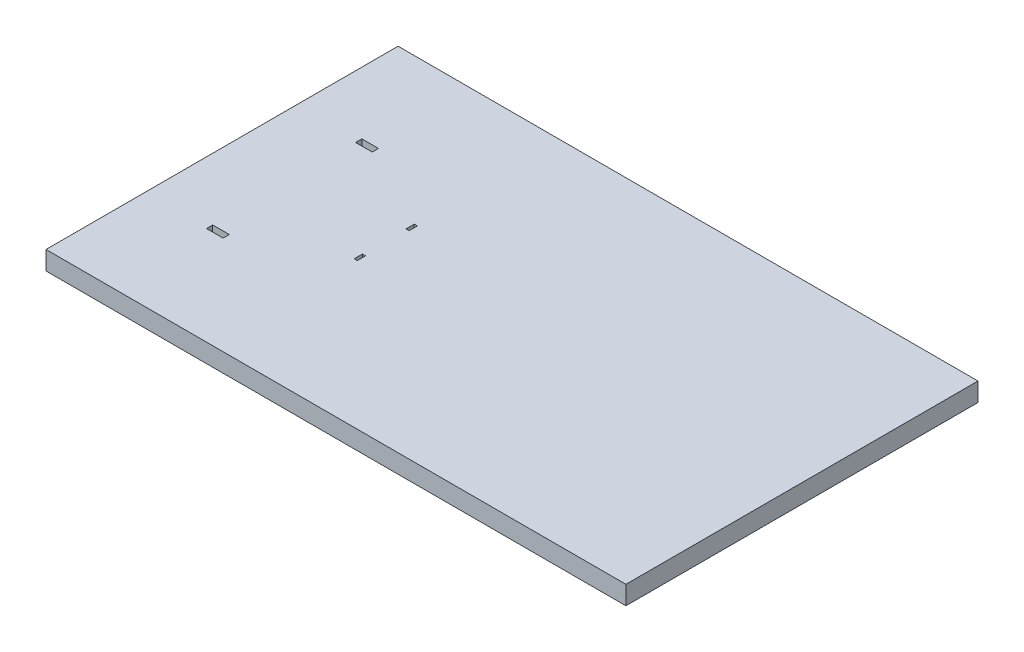
ISO-10303-21;
HEADER;
FILE_DESCRIPTION(('STEP AP214'),'2;1');
FILE_NAME('part.step','',(''),(''),'','','');
FILE_SCHEMA(('AUTOMOTIVE_DESIGN { 1 0 10303 214 1 1 1 1 }'));
ENDSEC;
DATA;
#1=APPLICATION_CONTEXT('core data for automotive mechanical design processes');
#2=APPLICATION_PROTOCOL_DEFINITION('international standard','automotive_design',2000,#1);
#3=PRODUCT_CONTEXT('',#1,'mechanical');
#4=PRODUCT('Part','Part','',(#3));
#5=PRODUCT_RELATED_PRODUCT_CATEGORY('part','',(#4));
#6=PRODUCT_DEFINITION_FORMATION('','',#4);
#7=PRODUCT_DEFINITION_CONTEXT('part definition',#1,'design');
#8=PRODUCT_DEFINITION('design','',#6,#7);
#9=PRODUCT_DEFINITION_SHAPE('','',#8);
#10=(LENGTH_UNIT() NAMED_UNIT(*) SI_UNIT(.MILLI.,.METRE.));
#11=(NAMED_UNIT(*) PLANE_ANGLE_UNIT() SI_UNIT($,.RADIAN.));
#12=(NAMED_UNIT(*) SI_UNIT($,.STERADIAN.) SOLID_ANGLE_UNIT());
#13=UNCERTAINTY_MEASURE_WITH_UNIT(LENGTH_MEASURE(1.E-05),#10,'distance_accuracy_value','');
#14=(GEOMETRIC_REPRESENTATION_CONTEXT(3) GLOBAL_UNCERTAINTY_ASSIGNED_CONTEXT((#13)) GLOBAL_UNIT_ASSIGNED_CONTEXT((#10,
#11,#12)) REPRESENTATION_CONTEXT('',''));
#15=CARTESIAN_POINT('',(0.,0.,0.));
#16=DIRECTION('',(0.,0.,1.));
#17=DIRECTION('',(1.,0.,0.));
#18=AXIS2_PLACEMENT_3D('',#15,#16,#17);
#19=CARTESIAN_POINT('',(0.,0.9,0.));
#20=DIRECTION('',(0.,-1.,0.));
#21=DIRECTION('',(0.,0.,-1.));
#22=AXIS2_PLACEMENT_3D('',#19,#20,#21);
#23=PLANE('',#22);
#24=DIRECTION('',(0.,0.,1.));
#25=VECTOR('',#24,1.);
#26=CARTESIAN_POINT('',(-6.17,0.9,1.05));
#27=LINE('',#26,#25);
#28=CARTESIAN_POINT('',(-6.17,0.9,1.05));
#29=VERTEX_POINT('',#28);
#30=CARTESIAN_POINT('',(-6.17,0.9,1.45));
#31=VERTEX_POINT('',#30);
#32=EDGE_CURVE('E206',#29,#31,#27,.T.);
#33=ORIENTED_EDGE('',*,*,#32,.F.);
#34=DIRECTION('',(-1.,0.,0.));
#35=VECTOR('',#34,1.);
#36=CARTESIAN_POINT('',(-6.17,0.9,1.05));
#37=LINE('',#36,#35);
#38=CARTESIAN_POINT('',(-6.02,0.9,1.05));
#39=VERTEX_POINT('',#38);
#40=EDGE_CURVE('E214',#39,#29,#37,.T.);
#41=ORIENTED_EDGE('',*,*,#40,.F.);
#42=DIRECTION('',(0.,0.,-1.));
#43=VECTOR('',#42,1.);
#44=CARTESIAN_POINT('',(-6.02,0.9,1.05));
#45=LINE('',#44,#43);
#46=CARTESIAN_POINT('',(-6.02,0.9,1.45));
#47=VERTEX_POINT('',#46);
#48=EDGE_CURVE('E211',#47,#39,#45,.T.);
#49=ORIENTED_EDGE('',*,*,#48,.F.);
#50=DIRECTION('',(1.,0.,0.));
#51=VECTOR('',#50,1.);
#52=CARTESIAN_POINT('',(-6.17,0.9,1.45));
#53=LINE('',#52,#51);
#54=EDGE_CURVE('E208',#31,#47,#53,.T.);
#55=ORIENTED_EDGE('',*,*,#54,.F.);
#56=EDGE_LOOP('',(#33,#41,#49,#55));
#57=FACE_BOUND('',#56,.T.);
#58=DIRECTION('',(0.,0.,1.));
#59=VECTOR('',#58,1.);
#60=CARTESIAN_POINT('',(-11.,0.9,3.45));
#61=LINE('',#60,#59);
#62=CARTESIAN_POINT('',(-11.,0.9,3.45));
#63=VERTEX_POINT('',#62);
#64=CARTESIAN_POINT('',(-11.,0.9,3.75));
#65=VERTEX_POINT('',#64);
#66=EDGE_CURVE('E268',#63,#65,#61,.T.);
#67=ORIENTED_EDGE('',*,*,#66,.F.);
#68=DIRECTION('',(-1.,0.,0.));
#69=VECTOR('',#68,1.);
#70=CARTESIAN_POINT('',(-11.,0.9,3.45));
#71=LINE('',#70,#69);
#72=CARTESIAN_POINT('',(-10.2,0.9,3.45));
#73=VERTEX_POINT('',#72);
#74=EDGE_CURVE('E276',#73,#63,#71,.T.);
#75=ORIENTED_EDGE('',*,*,#74,.F.);
#76=DIRECTION('',(0.,0.,-1.));
#77=VECTOR('',#76,1.);
#78=CARTESIAN_POINT('',(-10.2,0.9,3.45));
#79=LINE('',#78,#77);
#80=CARTESIAN_POINT('',(-10.2,0.9,3.75));
#81=VERTEX_POINT('',#80);
#82=EDGE_CURVE('E273',#81,#73,#79,.T.);
#83=ORIENTED_EDGE('',*,*,#82,.F.);
#84=DIRECTION('',(1.,0.,0.));
#85=VECTOR('',#84,1.);
#86=CARTESIAN_POINT('',(-11.,0.9,3.75));
#87=LINE('',#86,#85);
#88=EDGE_CURVE('E270',#65,#81,#87,.T.);
#89=ORIENTED_EDGE('',*,*,#88,.F.);
#90=EDGE_LOOP('',(#67,#75,#83,#89));
#91=FACE_BOUND('',#90,.T.);
#92=DIRECTION('',(0.,0.,-1.));
#93=VECTOR('',#92,1.);
#94=CARTESIAN_POINT('',(14.,0.9,8.5));
#95=LINE('',#94,#93);
#96=CARTESIAN_POINT('',(14.,0.9,8.5));
#97=VERTEX_POINT('',#96);
#98=CARTESIAN_POINT('',(14.,0.9,-8.5));
#99=VERTEX_POINT('',#98);
#100=EDGE_CURVE('E299',#97,#99,#95,.T.);
#101=ORIENTED_EDGE('',*,*,#100,.T.);
#102=DIRECTION('',(-1.,0.,0.));
#103=VECTOR('',#102,1.);
#104=CARTESIAN_POINT('',(-14.,0.9,-8.5));
#105=LINE('',#104,#103);
#106=CARTESIAN_POINT('',(-14.,0.9,-8.5));
#107=VERTEX_POINT('',#106);
#108=EDGE_CURVE('E302',#99,#107,#105,.T.);
#109=ORIENTED_EDGE('',*,*,#108,.T.);
#110=DIRECTION('',(0.,0.,1.));
#111=VECTOR('',#110,1.);
#112=CARTESIAN_POINT('',(-14.,0.9,8.5));
#113=LINE('',#112,#111);
#114=CARTESIAN_POINT('',(-14.,0.9,8.5));
#115=VERTEX_POINT('',#114);
#116=EDGE_CURVE('E305',#107,#115,#113,.T.);
#117=ORIENTED_EDGE('',*,*,#116,.T.);
#118=DIRECTION('',(1.,0.,0.));
#119=VECTOR('',#118,1.);
#120=CARTESIAN_POINT('',(-14.,0.9,8.5));
#121=LINE('',#120,#119);
#122=EDGE_CURVE('E307',#115,#97,#121,.T.);
#123=ORIENTED_EDGE('',*,*,#122,.T.);
#124=EDGE_LOOP('',(#101,#109,#117,#123));
#125=FACE_BOUND('',#124,.T.);
#126=DIRECTION('',(0.,0.,1.));
#127=VECTOR('',#126,1.);
#128=CARTESIAN_POINT('',(-11.,0.9,-3.75));
#129=LINE('',#128,#127);
#130=CARTESIAN_POINT('',(-11.,0.9,-3.75));
#131=VERTEX_POINT('',#130);
#132=CARTESIAN_POINT('',(-11.,0.9,-3.45));
#133=VERTEX_POINT('',#132);
#134=EDGE_CURVE('E237',#131,#133,#129,.T.);
#135=ORIENTED_EDGE('',*,*,#134,.F.);
#136=DIRECTION('',(-1.,0.,0.));
#137=VECTOR('',#136,1.);
#138=CARTESIAN_POINT('',(-11.,0.9,-3.75));
#139=LINE('',#138,#137);
#140=CARTESIAN_POINT('',(-10.2,0.9,-3.75));
#141=VERTEX_POINT('',#140);
#142=EDGE_CURVE('E245',#141,#131,#139,.T.);
#143=ORIENTED_EDGE('',*,*,#142,.F.);
#144=DIRECTION('',(0.,0.,-1.));
#145=VECTOR('',#144,1.);
#146=CARTESIAN_POINT('',(-10.2,0.9,-3.75));
#147=LINE('',#146,#145);
#148=CARTESIAN_POINT('',(-10.2,0.9,-3.45));
#149=VERTEX_POINT('',#148);
#150=EDGE_CURVE('E242',#149,#141,#147,.T.);
#151=ORIENTED_EDGE('',*,*,#150,.F.);
#152=DIRECTION('',(1.,0.,0.));
#153=VECTOR('',#152,1.);
#154=CARTESIAN_POINT('',(-11.,0.9,-3.45));
#155=LINE('',#154,#153);
#156=EDGE_CURVE('E239',#133,#149,#155,.T.);
#157=ORIENTED_EDGE('',*,*,#156,.F.);
#158=EDGE_LOOP('',(#135,#143,#151,#157));
#159=FACE_BOUND('',#158,.T.);
#160=DIRECTION('',(0.,0.,1.));
#161=VECTOR('',#160,1.);
#162=CARTESIAN_POINT('',(-6.17,0.9,-1.45));
#163=LINE('',#162,#161);
#164=CARTESIAN_POINT('',(-6.17,0.9,-1.45));
#165=VERTEX_POINT('',#164);
#166=CARTESIAN_POINT('',(-6.17,0.9,-1.05));
#167=VERTEX_POINT('',#166);
#168=EDGE_CURVE('E170',#165,#167,#163,.T.);
#169=ORIENTED_EDGE('',*,*,#168,.F.);
#170=DIRECTION('',(-1.,0.,0.));
#171=VECTOR('',#170,1.);
#172=CARTESIAN_POINT('',(-6.17,0.9,-1.45));
#173=LINE('',#172,#171);
#174=CARTESIAN_POINT('',(-6.02,0.9,-1.45));
#175=VERTEX_POINT('',#174);
#176=EDGE_CURVE('E192',#175,#165,#173,.T.);
#177=ORIENTED_EDGE('',*,*,#176,.F.);
#178=DIRECTION('',(0.,0.,-1.));
#179=VECTOR('',#178,1.);
#180=CARTESIAN_POINT('',(-6.02,0.9,-1.45));
#181=LINE('',#180,#179);
#182=CARTESIAN_POINT('',(-6.02,0.9,-1.05));
#183=VERTEX_POINT('',#182);
#184=EDGE_CURVE('E190',#183,#175,#181,.T.);
#185=ORIENTED_EDGE('',*,*,#184,.F.);
#186=DIRECTION('',(1.,0.,0.));
#187=VECTOR('',#186,1.);
#188=CARTESIAN_POINT('',(-6.17,0.9,-1.05));
#189=LINE('',#188,#187);
#190=EDGE_CURVE('E178',#167,#183,#189,.T.);
#191=ORIENTED_EDGE('',*,*,#190,.F.);
#192=EDGE_LOOP('',(#169,#177,#185,#191));
#193=FACE_BOUND('',#192,.T.);
#194=ADVANCED_FACE('F33',(#57,#91,#125,#159,#193),#23,.F.);
#195=CARTESIAN_POINT('',(0.,0.,0.));
#196=DIRECTION('',(0.,-1.,0.));
#197=DIRECTION('',(0.,0.,-1.));
#198=AXIS2_PLACEMENT_3D('',#195,#196,#197);
#199=PLANE('',#198);
#200=DIRECTION('',(0.,0.,-1.));
#201=VECTOR('',#200,1.);
#202=CARTESIAN_POINT('',(14.,0.,8.5));
#203=LINE('',#202,#201);
#204=CARTESIAN_POINT('',(14.,0.,8.5));
#205=VERTEX_POINT('',#204);
#206=CARTESIAN_POINT('',(14.,0.,-8.5));
#207=VERTEX_POINT('',#206);
#208=EDGE_CURVE('E298',#205,#207,#203,.T.);
#209=ORIENTED_EDGE('',*,*,#208,.F.);
#210=DIRECTION('',(1.,0.,0.));
#211=VECTOR('',#210,1.);
#212=CARTESIAN_POINT('',(-14.,0.,8.5));
#213=LINE('',#212,#211);
#214=CARTESIAN_POINT('',(-14.,0.,8.5));
#215=VERTEX_POINT('',#214);
#216=EDGE_CURVE('E303',#215,#205,#213,.T.);
#217=ORIENTED_EDGE('',*,*,#216,.F.);
#218=DIRECTION('',(0.,0.,1.));
#219=VECTOR('',#218,1.);
#220=CARTESIAN_POINT('',(-14.,0.,8.5));
#221=LINE('',#220,#219);
#222=CARTESIAN_POINT('',(-14.,0.,-8.5));
#223=VERTEX_POINT('',#222);
#224=EDGE_CURVE('E314',#223,#215,#221,.T.);
#225=ORIENTED_EDGE('',*,*,#224,.F.);
#226=DIRECTION('',(-1.,0.,0.));
#227=VECTOR('',#226,1.);
#228=CARTESIAN_POINT('',(-14.,0.,-8.5));
#229=LINE('',#228,#227);
#230=EDGE_CURVE('E312',#207,#223,#229,.T.);
#231=ORIENTED_EDGE('',*,*,#230,.F.);
#232=EDGE_LOOP('',(#209,#217,#225,#231));
#233=FACE_BOUND('',#232,.T.);
#234=DIRECTION('',(-1.,0.,0.));
#235=VECTOR('',#234,1.);
#236=CARTESIAN_POINT('',(-11.,0.,3.45));
#237=LINE('',#236,#235);
#238=CARTESIAN_POINT('',(-10.2,0.,3.45));
#239=VERTEX_POINT('',#238);
#240=CARTESIAN_POINT('',(-11.,0.,3.45));
#241=VERTEX_POINT('',#240);
#242=EDGE_CURVE('E271',#239,#241,#237,.T.);
#243=ORIENTED_EDGE('',*,*,#242,.T.);
#244=DIRECTION('',(0.,0.,1.));
#245=VECTOR('',#244,1.);
#246=CARTESIAN_POINT('',(-11.,0.,3.45));
#247=LINE('',#246,#245);
#248=CARTESIAN_POINT('',(-11.,0.,3.75));
#249=VERTEX_POINT('',#248);
#250=EDGE_CURVE('E267',#241,#249,#247,.T.);
#251=ORIENTED_EDGE('',*,*,#250,.T.);
#252=DIRECTION('',(1.,0.,0.));
#253=VECTOR('',#252,1.);
#254=CARTESIAN_POINT('',(-11.,0.,3.75));
#255=LINE('',#254,#253);
#256=CARTESIAN_POINT('',(-10.2,0.,3.75));
#257=VERTEX_POINT('',#256);
#258=EDGE_CURVE('E281',#249,#257,#255,.T.);
#259=ORIENTED_EDGE('',*,*,#258,.T.);
#260=DIRECTION('',(0.,0.,-1.));
#261=VECTOR('',#260,1.);
#262=CARTESIAN_POINT('',(-10.2,0.,3.45));
#263=LINE('',#262,#261);
#264=EDGE_CURVE('E284',#257,#239,#263,.T.);
#265=ORIENTED_EDGE('',*,*,#264,.T.);
#266=EDGE_LOOP('',(#243,#251,#259,#265));
#267=FACE_BOUND('',#266,.T.);
#268=DIRECTION('',(-1.,0.,0.));
#269=VECTOR('',#268,1.);
#270=CARTESIAN_POINT('',(-11.,0.,-3.75));
#271=LINE('',#270,#269);
#272=CARTESIAN_POINT('',(-10.2,0.,-3.75));
#273=VERTEX_POINT('',#272);
#274=CARTESIAN_POINT('',(-11.,0.,-3.75));
#275=VERTEX_POINT('',#274);
#276=EDGE_CURVE('E240',#273,#275,#271,.T.);
#277=ORIENTED_EDGE('',*,*,#276,.T.);
#278=DIRECTION('',(0.,0.,1.));
#279=VECTOR('',#278,1.);
#280=CARTESIAN_POINT('',(-11.,0.,-3.75));
#281=LINE('',#280,#279);
#282=CARTESIAN_POINT('',(-11.,0.,-3.45));
#283=VERTEX_POINT('',#282);
#284=EDGE_CURVE('E236',#275,#283,#281,.T.);
#285=ORIENTED_EDGE('',*,*,#284,.T.);
#286=DIRECTION('',(1.,0.,0.));
#287=VECTOR('',#286,1.);
#288=CARTESIAN_POINT('',(-11.,0.,-3.45));
#289=LINE('',#288,#287);
#290=CARTESIAN_POINT('',(-10.2,0.,-3.45));
#291=VERTEX_POINT('',#290);
#292=EDGE_CURVE('E250',#283,#291,#289,.T.);
#293=ORIENTED_EDGE('',*,*,#292,.T.);
#294=DIRECTION('',(0.,0.,-1.));
#295=VECTOR('',#294,1.);
#296=CARTESIAN_POINT('',(-10.2,0.,-3.75));
#297=LINE('',#296,#295);
#298=EDGE_CURVE('E253',#291,#273,#297,.T.);
#299=ORIENTED_EDGE('',*,*,#298,.T.);
#300=EDGE_LOOP('',(#277,#285,#293,#299));
#301=FACE_BOUND('',#300,.T.);
#302=DIRECTION('',(-1.,0.,0.));
#303=VECTOR('',#302,1.);
#304=CARTESIAN_POINT('',(-6.17,0.,1.05));
#305=LINE('',#304,#303);
#306=CARTESIAN_POINT('',(-6.02,0.,1.05));
#307=VERTEX_POINT('',#306);
#308=CARTESIAN_POINT('',(-6.17,0.,1.05));
#309=VERTEX_POINT('',#308);
#310=EDGE_CURVE('E209',#307,#309,#305,.T.);
#311=ORIENTED_EDGE('',*,*,#310,.T.);
#312=DIRECTION('',(0.,0.,1.));
#313=VECTOR('',#312,1.);
#314=CARTESIAN_POINT('',(-6.17,0.,1.05));
#315=LINE('',#314,#313);
#316=CARTESIAN_POINT('',(-6.17,0.,1.45));
#317=VERTEX_POINT('',#316);
#318=EDGE_CURVE('E186',#309,#317,#315,.T.);
#319=ORIENTED_EDGE('',*,*,#318,.T.);
#320=DIRECTION('',(1.,0.,0.));
#321=VECTOR('',#320,1.);
#322=CARTESIAN_POINT('',(-6.17,0.,1.45));
#323=LINE('',#322,#321);
#324=CARTESIAN_POINT('',(-6.02,0.,1.45));
#325=VERTEX_POINT('',#324);
#326=EDGE_CURVE('E219',#317,#325,#323,.T.);
#327=ORIENTED_EDGE('',*,*,#326,.T.);
#328=DIRECTION('',(0.,0.,-1.));
#329=VECTOR('',#328,1.);
#330=CARTESIAN_POINT('',(-6.02,0.,1.05));
#331=LINE('',#330,#329);
#332=EDGE_CURVE('E222',#325,#307,#331,.T.);
#333=ORIENTED_EDGE('',*,*,#332,.T.);
#334=EDGE_LOOP('',(#311,#319,#327,#333));
#335=FACE_BOUND('',#334,.T.);
#336=DIRECTION('',(-1.,0.,0.));
#337=VECTOR('',#336,1.);
#338=CARTESIAN_POINT('',(-6.17,0.,-1.45));
#339=LINE('',#338,#337);
#340=CARTESIAN_POINT('',(-6.02,0.,-1.45));
#341=VERTEX_POINT('',#340);
#342=CARTESIAN_POINT('',(-6.17,0.,-1.45));
#343=VERTEX_POINT('',#342);
#344=EDGE_CURVE('E179',#341,#343,#339,.T.);
#345=ORIENTED_EDGE('',*,*,#344,.T.);
#346=DIRECTION('',(0.,0.,1.));
#347=VECTOR('',#346,1.);
#348=CARTESIAN_POINT('',(-6.17,0.,-1.45));
#349=LINE('',#348,#347);
#350=CARTESIAN_POINT('',(-6.17,0.,-1.05));
#351=VERTEX_POINT('',#350);
#352=EDGE_CURVE('E56',#343,#351,#349,.T.);
#353=ORIENTED_EDGE('',*,*,#352,.T.);
#354=DIRECTION('',(1.,0.,0.));
#355=VECTOR('',#354,1.);
#356=CARTESIAN_POINT('',(-6.17,0.,-1.05));
#357=LINE('',#356,#355);
#358=CARTESIAN_POINT('',(-6.02,0.,-1.05));
#359=VERTEX_POINT('',#358);
#360=EDGE_CURVE('E185',#351,#359,#357,.T.);
#361=ORIENTED_EDGE('',*,*,#360,.T.);
#362=DIRECTION('',(0.,0.,-1.));
#363=VECTOR('',#362,1.);
#364=CARTESIAN_POINT('',(-6.02,0.,-1.45));
#365=LINE('',#364,#363);
#366=EDGE_CURVE('E198',#359,#341,#365,.T.);
#367=ORIENTED_EDGE('',*,*,#366,.T.);
#368=EDGE_LOOP('',(#345,#353,#361,#367));
#369=FACE_BOUND('',#368,.T.);
#370=ADVANCED_FACE('F332',(#233,#267,#301,#335,#369),#199,.T.);
#371=CARTESIAN_POINT('',(14.,0.9,8.5));
#372=DIRECTION('',(-1.,0.,0.));
#373=DIRECTION('',(0.,0.,1.));
#374=AXIS2_PLACEMENT_3D('',#371,#372,#373);
#375=PLANE('',#374);
#376=ORIENTED_EDGE('',*,*,#208,.T.);
#377=DIRECTION('',(0.,-1.,0.));
#378=VECTOR('',#377,1.);
#379=CARTESIAN_POINT('',(14.,0.9,-8.5));
#380=LINE('',#379,#378);
#381=EDGE_CURVE('E11',#99,#207,#380,.T.);
#382=ORIENTED_EDGE('',*,*,#381,.F.);
#383=ORIENTED_EDGE('',*,*,#100,.F.);
#384=DIRECTION('',(0.,-1.,0.));
#385=VECTOR('',#384,1.);
#386=CARTESIAN_POINT('',(14.,0.9,8.5));
#387=LINE('',#386,#385);
#388=EDGE_CURVE('E309',#97,#205,#387,.T.);
#389=ORIENTED_EDGE('',*,*,#388,.T.);
#390=EDGE_LOOP('',(#376,#382,#383,#389));
#391=FACE_BOUND('',#390,.T.);
#392=ADVANCED_FACE('F35',(#391),#375,.F.);
#393=CARTESIAN_POINT('',(-14.,0.9,-8.5));
#394=DIRECTION('',(0.,0.,1.));
#395=DIRECTION('',(1.,0.,0.));
#396=AXIS2_PLACEMENT_3D('',#393,#394,#395);
#397=PLANE('',#396);
#398=ORIENTED_EDGE('',*,*,#230,.T.);
#399=DIRECTION('',(0.,-1.,0.));
#400=VECTOR('',#399,1.);
#401=CARTESIAN_POINT('',(-14.,0.9,-8.5));
#402=LINE('',#401,#400);
#403=EDGE_CURVE('E41',#107,#223,#402,.T.);
#404=ORIENTED_EDGE('',*,*,#403,.F.);
#405=ORIENTED_EDGE('',*,*,#108,.F.);
#406=ORIENTED_EDGE('',*,*,#381,.T.);
#407=EDGE_LOOP('',(#398,#404,#405,#406));
#408=FACE_BOUND('',#407,.T.);
#409=ADVANCED_FACE('F343',(#408),#397,.F.);
#410=CARTESIAN_POINT('',(-14.,0.9,8.5));
#411=DIRECTION('',(1.,0.,0.));
#412=DIRECTION('',(0.,0.,-1.));
#413=AXIS2_PLACEMENT_3D('',#410,#411,#412);
#414=PLANE('',#413);
#415=ORIENTED_EDGE('',*,*,#224,.T.);
#416=DIRECTION('',(0.,-1.,0.));
#417=VECTOR('',#416,1.);
#418=CARTESIAN_POINT('',(-14.,0.9,8.5));
#419=LINE('',#418,#417);
#420=EDGE_CURVE('E319',#115,#215,#419,.T.);
#421=ORIENTED_EDGE('',*,*,#420,.F.);
#422=ORIENTED_EDGE('',*,*,#116,.F.);
#423=ORIENTED_EDGE('',*,*,#403,.T.);
#424=EDGE_LOOP('',(#415,#421,#422,#423));
#425=FACE_BOUND('',#424,.T.);
#426=ADVANCED_FACE('F326',(#425),#414,.F.);
#427=CARTESIAN_POINT('',(-14.,0.9,8.5));
#428=DIRECTION('',(0.,0.,-1.));
#429=DIRECTION('',(-1.,0.,0.));
#430=AXIS2_PLACEMENT_3D('',#427,#428,#429);
#431=PLANE('',#430);
#432=ORIENTED_EDGE('',*,*,#216,.T.);
#433=ORIENTED_EDGE('',*,*,#388,.F.);
#434=ORIENTED_EDGE('',*,*,#122,.F.);
#435=ORIENTED_EDGE('',*,*,#420,.T.);
#436=EDGE_LOOP('',(#432,#433,#434,#435));
#437=FACE_BOUND('',#436,.T.);
#438=ADVANCED_FACE('F336',(#437),#431,.F.);
#439=CARTESIAN_POINT('',(-11.,0.9,3.45));
#440=DIRECTION('',(1.,0.,0.));
#441=DIRECTION('',(0.,0.,-1.));
#442=AXIS2_PLACEMENT_3D('',#439,#440,#441);
#443=PLANE('',#442);
#444=ORIENTED_EDGE('',*,*,#250,.F.);
#445=DIRECTION('',(0.,-1.,0.));
#446=VECTOR('',#445,1.);
#447=CARTESIAN_POINT('',(-11.,0.9,3.45));
#448=LINE('',#447,#446);
#449=EDGE_CURVE('E278',#63,#241,#448,.T.);
#450=ORIENTED_EDGE('',*,*,#449,.F.);
#451=ORIENTED_EDGE('',*,*,#66,.T.);
#452=DIRECTION('',(0.,-1.,0.));
#453=VECTOR('',#452,1.);
#454=CARTESIAN_POINT('',(-11.,0.9,3.75));
#455=LINE('',#454,#453);
#456=EDGE_CURVE('E295',#65,#249,#455,.T.);
#457=ORIENTED_EDGE('',*,*,#456,.T.);
#458=EDGE_LOOP('',(#444,#450,#451,#457));
#459=FACE_BOUND('',#458,.T.);
#460=ADVANCED_FACE('F360',(#459),#443,.T.);
#461=CARTESIAN_POINT('',(-11.,0.9,3.75));
#462=DIRECTION('',(0.,0.,-1.));
#463=DIRECTION('',(-1.,0.,0.));
#464=AXIS2_PLACEMENT_3D('',#461,#462,#463);
#465=PLANE('',#464);
#466=ORIENTED_EDGE('',*,*,#258,.F.);
#467=ORIENTED_EDGE('',*,*,#456,.F.);
#468=ORIENTED_EDGE('',*,*,#88,.T.);
#469=DIRECTION('',(0.,-1.,0.));
#470=VECTOR('',#469,1.);
#471=CARTESIAN_POINT('',(-10.2,0.9,3.75));
#472=LINE('',#471,#470);
#473=EDGE_CURVE('E293',#81,#257,#472,.T.);
#474=ORIENTED_EDGE('',*,*,#473,.T.);
#475=EDGE_LOOP('',(#466,#467,#468,#474));
#476=FACE_BOUND('',#475,.T.);
#477=ADVANCED_FACE('F367',(#476),#465,.T.);
#478=CARTESIAN_POINT('',(-10.2,0.9,3.45));
#479=DIRECTION('',(-1.,0.,0.));
#480=DIRECTION('',(0.,0.,1.));
#481=AXIS2_PLACEMENT_3D('',#478,#479,#480);
#482=PLANE('',#481);
#483=ORIENTED_EDGE('',*,*,#264,.F.);
#484=ORIENTED_EDGE('',*,*,#473,.F.);
#485=ORIENTED_EDGE('',*,*,#82,.T.);
#486=DIRECTION('',(0.,-1.,0.));
#487=VECTOR('',#486,1.);
#488=CARTESIAN_POINT('',(-10.2,0.9,3.45));
#489=LINE('',#488,#487);
#490=EDGE_CURVE('E291',#73,#239,#489,.T.);
#491=ORIENTED_EDGE('',*,*,#490,.T.);
#492=EDGE_LOOP('',(#483,#484,#485,#491));
#493=FACE_BOUND('',#492,.T.);
#494=ADVANCED_FACE('F372',(#493),#482,.T.);
#495=CARTESIAN_POINT('',(-11.,0.9,3.45));
#496=DIRECTION('',(0.,0.,1.));
#497=DIRECTION('',(1.,0.,0.));
#498=AXIS2_PLACEMENT_3D('',#495,#496,#497);
#499=PLANE('',#498);
#500=ORIENTED_EDGE('',*,*,#242,.F.);
#501=ORIENTED_EDGE('',*,*,#490,.F.);
#502=ORIENTED_EDGE('',*,*,#74,.T.);
#503=ORIENTED_EDGE('',*,*,#449,.T.);
#504=EDGE_LOOP('',(#500,#501,#502,#503));
#505=FACE_BOUND('',#504,.T.);
#506=ADVANCED_FACE('F379',(#505),#499,.T.);
#507=CARTESIAN_POINT('',(-11.,0.9,-3.75));
#508=DIRECTION('',(1.,0.,0.));
#509=DIRECTION('',(0.,0.,-1.));
#510=AXIS2_PLACEMENT_3D('',#507,#508,#509);
#511=PLANE('',#510);
#512=ORIENTED_EDGE('',*,*,#284,.F.);
#513=DIRECTION('',(0.,-1.,0.));
#514=VECTOR('',#513,1.);
#515=CARTESIAN_POINT('',(-11.,0.9,-3.75));
#516=LINE('',#515,#514);
#517=EDGE_CURVE('E247',#131,#275,#516,.T.);
#518=ORIENTED_EDGE('',*,*,#517,.F.);
#519=ORIENTED_EDGE('',*,*,#134,.T.);
#520=DIRECTION('',(0.,-1.,0.));
#521=VECTOR('',#520,1.);
#522=CARTESIAN_POINT('',(-11.,0.9,-3.45));
#523=LINE('',#522,#521);
#524=EDGE_CURVE('E264',#133,#283,#523,.T.);
#525=ORIENTED_EDGE('',*,*,#524,.T.);
#526=EDGE_LOOP('',(#512,#518,#519,#525));
#527=FACE_BOUND('',#526,.T.);
#528=ADVANCED_FACE('F392',(#527),#511,.T.);
#529=CARTESIAN_POINT('',(-11.,0.9,-3.45));
#530=DIRECTION('',(0.,0.,-1.));
#531=DIRECTION('',(-1.,0.,0.));
#532=AXIS2_PLACEMENT_3D('',#529,#530,#531);
#533=PLANE('',#532);
#534=ORIENTED_EDGE('',*,*,#292,.F.);
#535=ORIENTED_EDGE('',*,*,#524,.F.);
#536=ORIENTED_EDGE('',*,*,#156,.T.);
#537=DIRECTION('',(0.,-1.,0.));
#538=VECTOR('',#537,1.);
#539=CARTESIAN_POINT('',(-10.2,0.9,-3.45));
#540=LINE('',#539,#538);
#541=EDGE_CURVE('E262',#149,#291,#540,.T.);
#542=ORIENTED_EDGE('',*,*,#541,.T.);
#543=EDGE_LOOP('',(#534,#535,#536,#542));
#544=FACE_BOUND('',#543,.T.);
#545=ADVANCED_FACE('F397',(#544),#533,.T.);
#546=CARTESIAN_POINT('',(-10.2,0.9,-3.75));
#547=DIRECTION('',(-1.,0.,0.));
#548=DIRECTION('',(0.,0.,1.));
#549=AXIS2_PLACEMENT_3D('',#546,#547,#548);
#550=PLANE('',#549);
#551=ORIENTED_EDGE('',*,*,#298,.F.);
#552=ORIENTED_EDGE('',*,*,#541,.F.);
#553=ORIENTED_EDGE('',*,*,#150,.T.);
#554=DIRECTION('',(0.,-1.,0.));
#555=VECTOR('',#554,1.);
#556=CARTESIAN_POINT('',(-10.2,0.9,-3.75));
#557=LINE('',#556,#555);
#558=EDGE_CURVE('E260',#141,#273,#557,.T.);
#559=ORIENTED_EDGE('',*,*,#558,.T.);
#560=EDGE_LOOP('',(#551,#552,#553,#559));
#561=FACE_BOUND('',#560,.T.);
#562=ADVANCED_FACE('F401',(#561),#550,.T.);
#563=CARTESIAN_POINT('',(-11.,0.9,-3.75));
#564=DIRECTION('',(0.,0.,1.));
#565=DIRECTION('',(1.,0.,0.));
#566=AXIS2_PLACEMENT_3D('',#563,#564,#565);
#567=PLANE('',#566);
#568=ORIENTED_EDGE('',*,*,#276,.F.);
#569=ORIENTED_EDGE('',*,*,#558,.F.);
#570=ORIENTED_EDGE('',*,*,#142,.T.);
#571=ORIENTED_EDGE('',*,*,#517,.T.);
#572=EDGE_LOOP('',(#568,#569,#570,#571));
#573=FACE_BOUND('',#572,.T.);
#574=ADVANCED_FACE('F405',(#573),#567,.T.);
#575=CARTESIAN_POINT('',(-6.17,0.9,1.05));
#576=DIRECTION('',(1.,0.,0.));
#577=DIRECTION('',(0.,0.,-1.));
#578=AXIS2_PLACEMENT_3D('',#575,#576,#577);
#579=PLANE('',#578);
#580=ORIENTED_EDGE('',*,*,#318,.F.);
#581=DIRECTION('',(0.,-1.,0.));
#582=VECTOR('',#581,1.);
#583=CARTESIAN_POINT('',(-6.17,0.9,1.05));
#584=LINE('',#583,#582);
#585=EDGE_CURVE('E216',#29,#309,#584,.T.);
#586=ORIENTED_EDGE('',*,*,#585,.F.);
#587=ORIENTED_EDGE('',*,*,#32,.T.);
#588=DIRECTION('',(0.,-1.,0.));
#589=VECTOR('',#588,1.);
#590=CARTESIAN_POINT('',(-6.17,0.9,1.45));
#591=LINE('',#590,#589);
#592=EDGE_CURVE('E233',#31,#317,#591,.T.);
#593=ORIENTED_EDGE('',*,*,#592,.T.);
#594=EDGE_LOOP('',(#580,#586,#587,#593));
#595=FACE_BOUND('',#594,.T.);
#596=ADVANCED_FACE('F409',(#595),#579,.T.);
#597=CARTESIAN_POINT('',(-6.17,0.9,1.45));
#598=DIRECTION('',(0.,0.,-1.));
#599=DIRECTION('',(-1.,0.,0.));
#600=AXIS2_PLACEMENT_3D('',#597,#598,#599);
#601=PLANE('',#600);
#602=ORIENTED_EDGE('',*,*,#326,.F.);
#603=ORIENTED_EDGE('',*,*,#592,.F.);
#604=ORIENTED_EDGE('',*,*,#54,.T.);
#605=DIRECTION('',(0.,-1.,0.));
#606=VECTOR('',#605,1.);
#607=CARTESIAN_POINT('',(-6.02,0.9,1.45));
#608=LINE('',#607,#606);
#609=EDGE_CURVE('E231',#47,#325,#608,.T.);
#610=ORIENTED_EDGE('',*,*,#609,.T.);
#611=EDGE_LOOP('',(#602,#603,#604,#610));
#612=FACE_BOUND('',#611,.T.);
#613=ADVANCED_FACE('F413',(#612),#601,.T.);
#614=CARTESIAN_POINT('',(-6.02,0.9,1.05));
#615=DIRECTION('',(-1.,0.,0.));
#616=DIRECTION('',(0.,0.,1.));
#617=AXIS2_PLACEMENT_3D('',#614,#615,#616);
#618=PLANE('',#617);
#619=ORIENTED_EDGE('',*,*,#332,.F.);
#620=ORIENTED_EDGE('',*,*,#609,.F.);
#621=ORIENTED_EDGE('',*,*,#48,.T.);
#622=DIRECTION('',(0.,-1.,0.));
#623=VECTOR('',#622,1.);
#624=CARTESIAN_POINT('',(-6.02,0.9,1.05));
#625=LINE('',#624,#623);
#626=EDGE_CURVE('E229',#39,#307,#625,.T.);
#627=ORIENTED_EDGE('',*,*,#626,.T.);
#628=EDGE_LOOP('',(#619,#620,#621,#627));
#629=FACE_BOUND('',#628,.T.);
#630=ADVANCED_FACE('F417',(#629),#618,.T.);
#631=CARTESIAN_POINT('',(-6.17,0.9,1.05));
#632=DIRECTION('',(0.,0.,1.));
#633=DIRECTION('',(1.,0.,0.));
#634=AXIS2_PLACEMENT_3D('',#631,#632,#633);
#635=PLANE('',#634);
#636=ORIENTED_EDGE('',*,*,#310,.F.);
#637=ORIENTED_EDGE('',*,*,#626,.F.);
#638=ORIENTED_EDGE('',*,*,#40,.T.);
#639=ORIENTED_EDGE('',*,*,#585,.T.);
#640=EDGE_LOOP('',(#636,#637,#638,#639));
#641=FACE_BOUND('',#640,.T.);
#642=ADVANCED_FACE('F421',(#641),#635,.T.);
#643=CARTESIAN_POINT('',(-6.17,0.9,-1.45));
#644=DIRECTION('',(1.,0.,0.));
#645=DIRECTION('',(0.,0.,-1.));
#646=AXIS2_PLACEMENT_3D('',#643,#644,#645);
#647=PLANE('',#646);
#648=ORIENTED_EDGE('',*,*,#352,.F.);
#649=DIRECTION('',(0.,-1.,0.));
#650=VECTOR('',#649,1.);
#651=CARTESIAN_POINT('',(-6.17,0.9,-1.45));
#652=LINE('',#651,#650);
#653=EDGE_CURVE('E174',#165,#343,#652,.T.);
#654=ORIENTED_EDGE('',*,*,#653,.F.);
#655=ORIENTED_EDGE('',*,*,#168,.T.);
#656=DIRECTION('',(0.,-1.,0.));
#657=VECTOR('',#656,1.);
#658=CARTESIAN_POINT('',(-6.17,0.9,-1.05));
#659=LINE('',#658,#657);
#660=EDGE_CURVE('E173',#167,#351,#659,.T.);
#661=ORIENTED_EDGE('',*,*,#660,.T.);
#662=EDGE_LOOP('',(#648,#654,#655,#661));
#663=FACE_BOUND('',#662,.T.);
#664=ADVANCED_FACE('F172',(#663),#647,.T.);
#665=CARTESIAN_POINT('',(-6.17,0.9,-1.05));
#666=DIRECTION('',(0.,0.,-1.));
#667=DIRECTION('',(-1.,0.,0.));
#668=AXIS2_PLACEMENT_3D('',#665,#666,#667);
#669=PLANE('',#668);
#670=ORIENTED_EDGE('',*,*,#360,.F.);
#671=ORIENTED_EDGE('',*,*,#660,.F.);
#672=ORIENTED_EDGE('',*,*,#190,.T.);
#673=DIRECTION('',(0.,-1.,0.));
#674=VECTOR('',#673,1.);
#675=CARTESIAN_POINT('',(-6.02,0.9,-1.05));
#676=LINE('',#675,#674);
#677=EDGE_CURVE('E187',#183,#359,#676,.T.);
#678=ORIENTED_EDGE('',*,*,#677,.T.);
#679=EDGE_LOOP('',(#670,#671,#672,#678));
#680=FACE_BOUND('',#679,.T.);
#681=ADVANCED_FACE('F182',(#680),#669,.T.);
#682=CARTESIAN_POINT('',(-6.02,0.9,-1.45));
#683=DIRECTION('',(-1.,0.,0.));
#684=DIRECTION('',(0.,0.,1.));
#685=AXIS2_PLACEMENT_3D('',#682,#683,#684);
#686=PLANE('',#685);
#687=ORIENTED_EDGE('',*,*,#366,.F.);
#688=ORIENTED_EDGE('',*,*,#677,.F.);
#689=ORIENTED_EDGE('',*,*,#184,.T.);
#690=DIRECTION('',(0.,-1.,0.));
#691=VECTOR('',#690,1.);
#692=CARTESIAN_POINT('',(-6.02,0.9,-1.45));
#693=LINE('',#692,#691);
#694=EDGE_CURVE('E48',#175,#341,#693,.T.);
#695=ORIENTED_EDGE('',*,*,#694,.T.);
#696=EDGE_LOOP('',(#687,#688,#689,#695));
#697=FACE_BOUND('',#696,.T.);
#698=ADVANCED_FACE('F430',(#697),#686,.T.);
#699=CARTESIAN_POINT('',(-6.17,0.9,-1.45));
#700=DIRECTION('',(0.,0.,1.));
#701=DIRECTION('',(1.,0.,0.));
#702=AXIS2_PLACEMENT_3D('',#699,#700,#701);
#703=PLANE('',#702);
#704=ORIENTED_EDGE('',*,*,#344,.F.);
#705=ORIENTED_EDGE('',*,*,#694,.F.);
#706=ORIENTED_EDGE('',*,*,#176,.T.);
#707=ORIENTED_EDGE('',*,*,#653,.T.);
#708=EDGE_LOOP('',(#704,#705,#706,#707));
#709=FACE_BOUND('',#708,.T.);
#710=ADVANCED_FACE('F433',(#709),#703,.T.);
#711=CLOSED_SHELL('',(#194,#370,#392,#409,#426,#438,#460,#477,#494,#506,#528,#545,#562,#574,
#596,#613,#630,#642,#664,#681,#698,#710));
#712=MANIFOLD_SOLID_BREP('B2',#711);
#713=ADVANCED_BREP_SHAPE_REPRESENTATION('',(#18,#712),#14);
#714=SHAPE_DEFINITION_REPRESENTATION(#9,#713);
ENDSEC;
END-ISO-10303-21;
